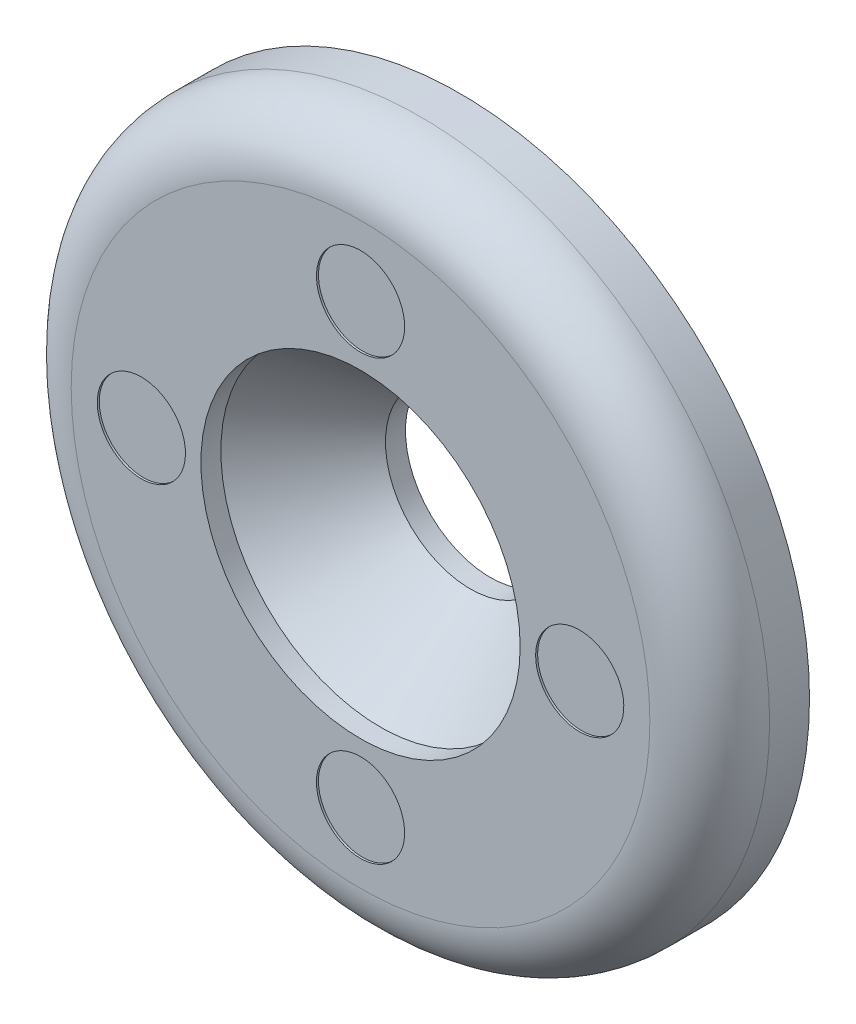
ISO-10303-21;
HEADER;
FILE_DESCRIPTION(('STEP AP214'),'2;1');
FILE_NAME('part.step','',(''),(''),'','','');
FILE_SCHEMA(('AUTOMOTIVE_DESIGN { 1 0 10303 214 1 1 1 1 }'));
ENDSEC;
DATA;
#1=APPLICATION_CONTEXT('core data for automotive mechanical design processes');
#2=APPLICATION_PROTOCOL_DEFINITION('international standard','automotive_design',2000,#1);
#3=PRODUCT_CONTEXT('',#1,'mechanical');
#4=PRODUCT('Part','Part','',(#3));
#5=PRODUCT_RELATED_PRODUCT_CATEGORY('part','',(#4));
#6=PRODUCT_DEFINITION_FORMATION('','',#4);
#7=PRODUCT_DEFINITION_CONTEXT('part definition',#1,'design');
#8=PRODUCT_DEFINITION('design','',#6,#7);
#9=PRODUCT_DEFINITION_SHAPE('','',#8);
#10=(LENGTH_UNIT() NAMED_UNIT(*) SI_UNIT(.MILLI.,.METRE.));
#11=(NAMED_UNIT(*) PLANE_ANGLE_UNIT() SI_UNIT($,.RADIAN.));
#12=(NAMED_UNIT(*) SI_UNIT($,.STERADIAN.) SOLID_ANGLE_UNIT());
#13=UNCERTAINTY_MEASURE_WITH_UNIT(LENGTH_MEASURE(1.E-05),#10,'distance_accuracy_value','');
#14=(GEOMETRIC_REPRESENTATION_CONTEXT(3) GLOBAL_UNCERTAINTY_ASSIGNED_CONTEXT((#13)) GLOBAL_UNIT_ASSIGNED_CONTEXT((#10,
#11,#12)) REPRESENTATION_CONTEXT('',''));
#15=CARTESIAN_POINT('',(0.,0.,0.));
#16=DIRECTION('',(0.,0.,1.));
#17=DIRECTION('',(1.,0.,0.));
#18=AXIS2_PLACEMENT_3D('',#15,#16,#17);
#19=CARTESIAN_POINT('',(0.,0.,0.));
#20=DIRECTION('',(0.,0.,1.));
#21=DIRECTION('',(1.,0.,0.));
#22=AXIS2_PLACEMENT_3D('',#19,#20,#21);
#23=CYLINDRICAL_SURFACE('',#22,4.25);
#24=CARTESIAN_POINT('',(0.,0.,-6.5));
#25=DIRECTION('',(0.,0.,1.));
#26=DIRECTION('',(1.,0.,0.));
#27=AXIS2_PLACEMENT_3D('',#24,#25,#26);
#28=CIRCLE('',#27,4.25);
#29=CARTESIAN_POINT('',(4.25,0.,-6.5));
#30=VERTEX_POINT('',#29);
#31=EDGE_CURVE('E56',#30,#30,#28,.T.);
#32=ORIENTED_EDGE('',*,*,#31,.F.);
#33=EDGE_LOOP('',(#32));
#34=FACE_BOUND('',#33,.T.);
#35=CARTESIAN_POINT('',(0.,0.,-5.5));
#36=DIRECTION('',(0.,0.,1.));
#37=DIRECTION('',(1.,0.,0.));
#38=AXIS2_PLACEMENT_3D('',#35,#36,#37);
#39=CIRCLE('',#38,4.25);
#40=CARTESIAN_POINT('',(4.25,0.,-5.5));
#41=VERTEX_POINT('',#40);
#42=EDGE_CURVE('E68',#41,#41,#39,.T.);
#43=ORIENTED_EDGE('',*,*,#42,.T.);
#44=EDGE_LOOP('',(#43));
#45=FACE_BOUND('',#44,.T.);
#46=ADVANCED_FACE('F30',(#34,#45),#23,.F.);
#47=CARTESIAN_POINT('',(0.,4.25,-6.5));
#48=DIRECTION('',(0.,0.,1.));
#49=DIRECTION('',(1.,0.,0.));
#50=AXIS2_PLACEMENT_3D('',#47,#48,#49);
#51=PLANE('',#50);
#52=CARTESIAN_POINT('',(0.,0.,-6.5));
#53=DIRECTION('',(0.,0.,1.));
#54=DIRECTION('',(1.,0.,0.));
#55=AXIS2_PLACEMENT_3D('',#52,#53,#54);
#56=CIRCLE('',#55,7.78162505401556);
#57=CARTESIAN_POINT('',(7.78162505401556,0.,-6.5));
#58=VERTEX_POINT('',#57);
#59=EDGE_CURVE('E10',#58,#58,#56,.F.);
#60=ORIENTED_EDGE('',*,*,#59,.T.);
#61=EDGE_LOOP('',(#60));
#62=FACE_BOUND('',#61,.T.);
#63=ORIENTED_EDGE('',*,*,#31,.T.);
#64=EDGE_LOOP('',(#63));
#65=FACE_BOUND('',#64,.T.);
#66=ADVANCED_FACE('F133',(#62,#65),#51,.F.);
#67=CARTESIAN_POINT('',(0.,0.,-6.5));
#68=DIRECTION('',(0.,0.,1.));
#69=DIRECTION('',(1.,0.,0.));
#70=AXIS2_PLACEMENT_3D('',#67,#68,#69);
#71=CONICAL_SURFACE('',#70,8.25,0.694738276196703);
#72=CARTESIAN_POINT('',(0.,0.,-5.35981560033552));
#73=DIRECTION('',(0.,0.,1.));
#74=DIRECTION('',(1.,0.,0.));
#75=AXIS2_PLACEMENT_3D('',#72,#73,#74);
#76=CIRCLE('',#75,9.20015366638707);
#77=CARTESIAN_POINT('',(9.20015366638707,0.,-5.35981560033552));
#78=VERTEX_POINT('',#77);
#79=EDGE_CURVE('E37',#78,#78,#76,.F.);
#80=ORIENTED_EDGE('',*,*,#79,.T.);
#81=EDGE_LOOP('',(#80));
#82=FACE_BOUND('',#81,.T.);
#83=CARTESIAN_POINT('',(0.,0.,-6.14018439966448));
#84=DIRECTION('',(0.,0.,-1.));
#85=DIRECTION('',(-1.,0.,0.));
#86=AXIS2_PLACEMENT_3D('',#83,#84,#85);
#87=CIRCLE('',#86,8.54984633361293);
#88=CARTESIAN_POINT('',(-8.54984633361293,0.,-6.14018439966448));
#89=VERTEX_POINT('',#88);
#90=EDGE_CURVE('E41',#89,#89,#87,.F.);
#91=ORIENTED_EDGE('',*,*,#90,.T.);
#92=EDGE_LOOP('',(#91));
#93=FACE_BOUND('',#92,.T.);
#94=ADVANCED_FACE('F139',(#82,#93),#71,.T.);
#95=CARTESIAN_POINT('',(0.,9.5,-5.));
#96=DIRECTION('',(0.,0.,1.));
#97=DIRECTION('',(1.,0.,0.));
#98=AXIS2_PLACEMENT_3D('',#95,#96,#97);
#99=PLANE('',#98);
#100=CARTESIAN_POINT('',(0.,0.,-5.));
#101=DIRECTION('',(0.,0.,1.));
#102=DIRECTION('',(1.,0.,0.));
#103=AXIS2_PLACEMENT_3D('',#100,#101,#102);
#104=CIRCLE('',#103,9.96837494598444);
#105=CARTESIAN_POINT('',(9.96837494598444,0.,-5.));
#106=VERTEX_POINT('',#105);
#107=EDGE_CURVE('E45',#106,#106,#104,.T.);
#108=ORIENTED_EDGE('',*,*,#107,.T.);
#109=EDGE_LOOP('',(#108));
#110=FACE_BOUND('',#109,.T.);
#111=CARTESIAN_POINT('',(0.,0.,-5.));
#112=DIRECTION('',(0.,0.,1.));
#113=DIRECTION('',(1.,0.,0.));
#114=AXIS2_PLACEMENT_3D('',#111,#112,#113);
#115=CIRCLE('',#114,17.5);
#116=CARTESIAN_POINT('',(17.5,0.,-5.));
#117=VERTEX_POINT('',#116);
#118=EDGE_CURVE('E59',#117,#117,#115,.T.);
#119=ORIENTED_EDGE('',*,*,#118,.F.);
#120=EDGE_LOOP('',(#119));
#121=FACE_BOUND('',#120,.T.);
#122=ADVANCED_FACE('F160',(#110,#121),#99,.F.);
#123=CARTESIAN_POINT('',(0.,0.,0.));
#124=DIRECTION('',(0.,0.,1.));
#125=DIRECTION('',(1.,0.,0.));
#126=AXIS2_PLACEMENT_3D('',#123,#124,#125);
#127=CYLINDRICAL_SURFACE('',#126,17.5);
#128=CARTESIAN_POINT('',(0.,0.,-3.));
#129=DIRECTION('',(0.,0.,-1.));
#130=DIRECTION('',(-1.,0.,0.));
#131=AXIS2_PLACEMENT_3D('',#128,#129,#130);
#132=CIRCLE('',#131,17.5);
#133=CARTESIAN_POINT('',(-17.5,0.,-3.));
#134=VERTEX_POINT('',#133);
#135=EDGE_CURVE('E50',#134,#134,#132,.T.);
#136=ORIENTED_EDGE('',*,*,#135,.T.);
#137=EDGE_LOOP('',(#136));
#138=FACE_BOUND('',#137,.T.);
#139=ORIENTED_EDGE('',*,*,#118,.T.);
#140=EDGE_LOOP('',(#139));
#141=FACE_BOUND('',#140,.T.);
#142=ADVANCED_FACE('F109',(#138,#141),#127,.T.);
#143=CARTESIAN_POINT('',(0.,17.5,0.));
#144=DIRECTION('',(0.,0.,-1.));
#145=DIRECTION('',(-1.,0.,0.));
#146=AXIS2_PLACEMENT_3D('',#143,#144,#145);
#147=PLANE('',#146);
#148=CARTESIAN_POINT('',(-10.9833227562567,0.,0.));
#149=DIRECTION('',(0.,0.,1.));
#150=DIRECTION('',(0.,1.,0.));
#151=AXIS2_PLACEMENT_3D('',#148,#149,#150);
#152=CIRCLE('',#151,2.20906945363147);
#153=CARTESIAN_POINT('',(-10.9833227562567,2.20906945363143,0.));
#154=VERTEX_POINT('',#153);
#155=EDGE_CURVE('E90',#154,#154,#152,.T.);
#156=ORIENTED_EDGE('',*,*,#155,.F.);
#157=EDGE_LOOP('',(#156));
#158=FACE_BOUND('',#157,.T.);
#159=CARTESIAN_POINT('',(0.,-10.9833227562567,0.));
#160=DIRECTION('',(0.,0.,1.));
#161=DIRECTION('',(-1.,0.,0.));
#162=AXIS2_PLACEMENT_3D('',#159,#160,#161);
#163=CIRCLE('',#162,2.20906945363147);
#164=CARTESIAN_POINT('',(-2.20906945363147,-10.9833227562567,0.));
#165=VERTEX_POINT('',#164);
#166=EDGE_CURVE('E84',#165,#165,#163,.T.);
#167=ORIENTED_EDGE('',*,*,#166,.F.);
#168=EDGE_LOOP('',(#167));
#169=FACE_BOUND('',#168,.T.);
#170=CARTESIAN_POINT('',(10.9833227562567,1.15044199325884E-13,0.));
#171=DIRECTION('',(0.,0.,1.));
#172=DIRECTION('',(0.,-1.,0.));
#173=AXIS2_PLACEMENT_3D('',#170,#171,#172);
#174=CIRCLE('',#173,2.20906945363147);
#175=CARTESIAN_POINT('',(10.9833227562567,-2.20906945363136,0.));
#176=VERTEX_POINT('',#175);
#177=EDGE_CURVE('E78',#176,#176,#174,.T.);
#178=ORIENTED_EDGE('',*,*,#177,.F.);
#179=EDGE_LOOP('',(#178));
#180=FACE_BOUND('',#179,.T.);
#181=CARTESIAN_POINT('',(0.,10.9833227562567,0.));
#182=DIRECTION('',(0.,0.,1.));
#183=DIRECTION('',(1.,0.,0.));
#184=AXIS2_PLACEMENT_3D('',#181,#182,#183);
#185=CIRCLE('',#184,2.20906945363147);
#186=CARTESIAN_POINT('',(2.20906945363147,10.9833227562567,0.));
#187=VERTEX_POINT('',#186);
#188=EDGE_CURVE('E72',#187,#187,#185,.T.);
#189=ORIENTED_EDGE('',*,*,#188,.F.);
#190=EDGE_LOOP('',(#189));
#191=FACE_BOUND('',#190,.T.);
#192=CARTESIAN_POINT('',(0.,0.,0.));
#193=DIRECTION('',(0.,0.,-1.));
#194=DIRECTION('',(-1.,0.,0.));
#195=AXIS2_PLACEMENT_3D('',#192,#193,#194);
#196=CIRCLE('',#195,14.5);
#197=CARTESIAN_POINT('',(-14.5,0.,0.));
#198=VERTEX_POINT('',#197);
#199=EDGE_CURVE('E53',#198,#198,#196,.F.);
#200=ORIENTED_EDGE('',*,*,#199,.T.);
#201=EDGE_LOOP('',(#200));
#202=FACE_BOUND('',#201,.T.);
#203=CARTESIAN_POINT('',(0.,0.,0.));
#204=DIRECTION('',(0.,0.,1.));
#205=DIRECTION('',(1.,0.,0.));
#206=AXIS2_PLACEMENT_3D('',#203,#204,#205);
#207=CIRCLE('',#206,8.);
#208=CARTESIAN_POINT('',(8.,0.,0.));
#209=VERTEX_POINT('',#208);
#210=EDGE_CURVE('E62',#209,#209,#207,.T.);
#211=ORIENTED_EDGE('',*,*,#210,.F.);
#212=EDGE_LOOP('',(#211));
#213=FACE_BOUND('',#212,.T.);
#214=ADVANCED_FACE('F105',(#158,#169,#180,#191,#202,#213),#147,.F.);
#215=CARTESIAN_POINT('',(0.,0.,0.));
#216=DIRECTION('',(0.,0.,1.));
#217=DIRECTION('',(1.,0.,0.));
#218=AXIS2_PLACEMENT_3D('',#215,#216,#217);
#219=CYLINDRICAL_SURFACE('',#218,8.);
#220=CARTESIAN_POINT('',(0.,0.,-1.));
#221=DIRECTION('',(0.,0.,1.));
#222=DIRECTION('',(1.,0.,0.));
#223=AXIS2_PLACEMENT_3D('',#220,#221,#222);
#224=CIRCLE('',#223,8.);
#225=CARTESIAN_POINT('',(8.,0.,-1.));
#226=VERTEX_POINT('',#225);
#227=EDGE_CURVE('E65',#226,#226,#224,.T.);
#228=ORIENTED_EDGE('',*,*,#227,.F.);
#229=EDGE_LOOP('',(#228));
#230=FACE_BOUND('',#229,.T.);
#231=ORIENTED_EDGE('',*,*,#210,.T.);
#232=EDGE_LOOP('',(#231));
#233=FACE_BOUND('',#232,.T.);
#234=ADVANCED_FACE('F108',(#230,#233),#219,.F.);
#235=CARTESIAN_POINT('',(0.,0.,-1.));
#236=DIRECTION('',(0.,0.,1.));
#237=DIRECTION('',(1.,0.,0.));
#238=AXIS2_PLACEMENT_3D('',#235,#236,#237);
#239=CONICAL_SURFACE('',#238,8.,0.694738276196703);
#240=ORIENTED_EDGE('',*,*,#42,.F.);
#241=EDGE_LOOP('',(#240));
#242=FACE_BOUND('',#241,.T.);
#243=ORIENTED_EDGE('',*,*,#227,.T.);
#244=EDGE_LOOP('',(#243));
#245=FACE_BOUND('',#244,.T.);
#246=ADVANCED_FACE('F122',(#242,#245),#239,.F.);
#247=CARTESIAN_POINT('',(0.,0.,-3.));
#248=DIRECTION('',(0.,0.,-1.));
#249=DIRECTION('',(-1.,0.,0.));
#250=AXIS2_PLACEMENT_3D('',#247,#248,#249);
#251=TOROIDAL_SURFACE('',#250,14.5,3.);
#252=ORIENTED_EDGE('',*,*,#135,.F.);
#253=EDGE_LOOP('',(#252));
#254=FACE_BOUND('',#253,.T.);
#255=ORIENTED_EDGE('',*,*,#199,.F.);
#256=EDGE_LOOP('',(#255));
#257=FACE_BOUND('',#256,.T.);
#258=ADVANCED_FACE('F128',(#254,#257),#251,.T.);
#259=CARTESIAN_POINT('',(0.,10.9833227562567,-0.1));
#260=DIRECTION('',(0.,0.,1.));
#261=DIRECTION('',(1.,0.,0.));
#262=AXIS2_PLACEMENT_3D('',#259,#260,#261);
#263=CYLINDRICAL_SURFACE('',#262,2.20906945363147);
#264=CARTESIAN_POINT('',(0.,10.9833227562567,-0.1));
#265=DIRECTION('',(0.,0.,1.));
#266=DIRECTION('',(1.,0.,0.));
#267=AXIS2_PLACEMENT_3D('',#264,#265,#266);
#268=CIRCLE('',#267,2.20906945363147);
#269=CARTESIAN_POINT('',(2.20906945363147,10.9833227562567,-0.1));
#270=VERTEX_POINT('',#269);
#271=EDGE_CURVE('E71',#270,#270,#268,.T.);
#272=ORIENTED_EDGE('',*,*,#271,.F.);
#273=EDGE_LOOP('',(#272));
#274=FACE_BOUND('',#273,.T.);
#275=ORIENTED_EDGE('',*,*,#188,.T.);
#276=EDGE_LOOP('',(#275));
#277=FACE_BOUND('',#276,.T.);
#278=ADVANCED_FACE('F146',(#274,#277),#263,.F.);
#279=CARTESIAN_POINT('',(0.,10.9833227562567,-0.1));
#280=DIRECTION('',(0.,0.,1.));
#281=DIRECTION('',(1.,0.,0.));
#282=AXIS2_PLACEMENT_3D('',#279,#280,#281);
#283=PLANE('',#282);
#284=ORIENTED_EDGE('',*,*,#271,.T.);
#285=EDGE_LOOP('',(#284));
#286=FACE_BOUND('',#285,.T.);
#287=ADVANCED_FACE('F241',(#286),#283,.T.);
#288=CARTESIAN_POINT('',(10.9833227562567,1.15044199325884E-13,-0.1));
#289=DIRECTION('',(0.,0.,1.));
#290=DIRECTION('',(1.,0.,0.));
#291=AXIS2_PLACEMENT_3D('',#288,#289,#290);
#292=CYLINDRICAL_SURFACE('',#291,2.20906945363147);
#293=CARTESIAN_POINT('',(10.9833227562567,1.15044199325884E-13,-0.1));
#294=DIRECTION('',(0.,0.,1.));
#295=DIRECTION('',(0.,-1.,0.));
#296=AXIS2_PLACEMENT_3D('',#293,#294,#295);
#297=CIRCLE('',#296,2.20906945363147);
#298=CARTESIAN_POINT('',(10.9833227562567,-2.20906945363136,-0.1));
#299=VERTEX_POINT('',#298);
#300=EDGE_CURVE('E81',#299,#299,#297,.T.);
#301=ORIENTED_EDGE('',*,*,#300,.F.);
#302=EDGE_LOOP('',(#301));
#303=FACE_BOUND('',#302,.T.);
#304=ORIENTED_EDGE('',*,*,#177,.T.);
#305=EDGE_LOOP('',(#304));
#306=FACE_BOUND('',#305,.T.);
#307=ADVANCED_FACE('F232',(#303,#306),#292,.F.);
#308=CARTESIAN_POINT('',(10.9833227562567,1.15044199325884E-13,-0.1));
#309=DIRECTION('',(0.,0.,1.));
#310=DIRECTION('',(0.,-1.,0.));
#311=AXIS2_PLACEMENT_3D('',#308,#309,#310);
#312=PLANE('',#311);
#313=ORIENTED_EDGE('',*,*,#300,.T.);
#314=EDGE_LOOP('',(#313));
#315=FACE_BOUND('',#314,.T.);
#316=ADVANCED_FACE('F223',(#315),#312,.T.);
#317=CARTESIAN_POINT('',(0.,-10.9833227562567,-0.1));
#318=DIRECTION('',(0.,0.,1.));
#319=DIRECTION('',(1.,0.,0.));
#320=AXIS2_PLACEMENT_3D('',#317,#318,#319);
#321=CYLINDRICAL_SURFACE('',#320,2.20906945363147);
#322=CARTESIAN_POINT('',(0.,-10.9833227562567,-0.1));
#323=DIRECTION('',(0.,0.,1.));
#324=DIRECTION('',(-1.,0.,0.));
#325=AXIS2_PLACEMENT_3D('',#322,#323,#324);
#326=CIRCLE('',#325,2.20906945363147);
#327=CARTESIAN_POINT('',(-2.20906945363147,-10.9833227562567,-0.1));
#328=VERTEX_POINT('',#327);
#329=EDGE_CURVE('E87',#328,#328,#326,.T.);
#330=ORIENTED_EDGE('',*,*,#329,.F.);
#331=EDGE_LOOP('',(#330));
#332=FACE_BOUND('',#331,.T.);
#333=ORIENTED_EDGE('',*,*,#166,.T.);
#334=EDGE_LOOP('',(#333));
#335=FACE_BOUND('',#334,.T.);
#336=ADVANCED_FACE('F214',(#332,#335),#321,.F.);
#337=CARTESIAN_POINT('',(0.,-10.9833227562567,-0.1));
#338=DIRECTION('',(0.,0.,1.));
#339=DIRECTION('',(-1.,0.,0.));
#340=AXIS2_PLACEMENT_3D('',#337,#338,#339);
#341=PLANE('',#340);
#342=ORIENTED_EDGE('',*,*,#329,.T.);
#343=EDGE_LOOP('',(#342));
#344=FACE_BOUND('',#343,.T.);
#345=ADVANCED_FACE('F101',(#344),#341,.T.);
#346=CARTESIAN_POINT('',(-10.9833227562567,0.,-0.1));
#347=DIRECTION('',(0.,0.,1.));
#348=DIRECTION('',(1.,0.,0.));
#349=AXIS2_PLACEMENT_3D('',#346,#347,#348);
#350=CYLINDRICAL_SURFACE('',#349,2.20906945363147);
#351=CARTESIAN_POINT('',(-10.9833227562567,0.,-0.1));
#352=DIRECTION('',(0.,0.,1.));
#353=DIRECTION('',(0.,1.,0.));
#354=AXIS2_PLACEMENT_3D('',#351,#352,#353);
#355=CIRCLE('',#354,2.20906945363147);
#356=CARTESIAN_POINT('',(-10.9833227562567,2.20906945363143,-0.1));
#357=VERTEX_POINT('',#356);
#358=EDGE_CURVE('E75',#357,#357,#355,.T.);
#359=ORIENTED_EDGE('',*,*,#358,.F.);
#360=EDGE_LOOP('',(#359));
#361=FACE_BOUND('',#360,.T.);
#362=ORIENTED_EDGE('',*,*,#155,.T.);
#363=EDGE_LOOP('',(#362));
#364=FACE_BOUND('',#363,.T.);
#365=ADVANCED_FACE('F98',(#361,#364),#350,.F.);
#366=CARTESIAN_POINT('',(-10.9833227562567,0.,-0.1));
#367=DIRECTION('',(0.,0.,1.));
#368=DIRECTION('',(0.,1.,0.));
#369=AXIS2_PLACEMENT_3D('',#366,#367,#368);
#370=PLANE('',#369);
#371=ORIENTED_EDGE('',*,*,#358,.T.);
#372=EDGE_LOOP('',(#371));
#373=FACE_BOUND('',#372,.T.);
#374=ADVANCED_FACE('F96',(#373),#370,.T.);
#375=CARTESIAN_POINT('',(0.,0.,-6.));
#376=DIRECTION('',(0.,0.,1.));
#377=DIRECTION('',(1.,0.,0.));
#378=AXIS2_PLACEMENT_3D('',#375,#376,#377);
#379=TOROIDAL_SURFACE('',#378,9.96837494598444,1.);
#380=ORIENTED_EDGE('',*,*,#79,.F.);
#381=EDGE_LOOP('',(#380));
#382=FACE_BOUND('',#381,.T.);
#383=ORIENTED_EDGE('',*,*,#107,.F.);
#384=EDGE_LOOP('',(#383));
#385=FACE_BOUND('',#384,.T.);
#386=ADVANCED_FACE('F148',(#382,#385),#379,.F.);
#387=CARTESIAN_POINT('',(0.,0.,-5.5));
#388=DIRECTION('',(0.,0.,1.));
#389=DIRECTION('',(1.,0.,0.));
#390=AXIS2_PLACEMENT_3D('',#387,#388,#389);
#391=TOROIDAL_SURFACE('',#390,7.78162505401556,1.);
#392=ORIENTED_EDGE('',*,*,#59,.F.);
#393=EDGE_LOOP('',(#392));
#394=FACE_BOUND('',#393,.T.);
#395=ORIENTED_EDGE('',*,*,#90,.F.);
#396=EDGE_LOOP('',(#395));
#397=FACE_BOUND('',#396,.T.);
#398=ADVANCED_FACE('F32',(#394,#397),#391,.T.);
#399=CLOSED_SHELL('',(#46,#66,#94,#122,#142,#214,#234,#246,#258,#278,#287,#307,#316,#336,#345,
#365,#374,#386,#398));
#400=MANIFOLD_SOLID_BREP('B2',#399);
#401=ADVANCED_BREP_SHAPE_REPRESENTATION('',(#18,#400),#14);
#402=SHAPE_DEFINITION_REPRESENTATION(#9,#401);
ENDSEC;
END-ISO-10303-21;
